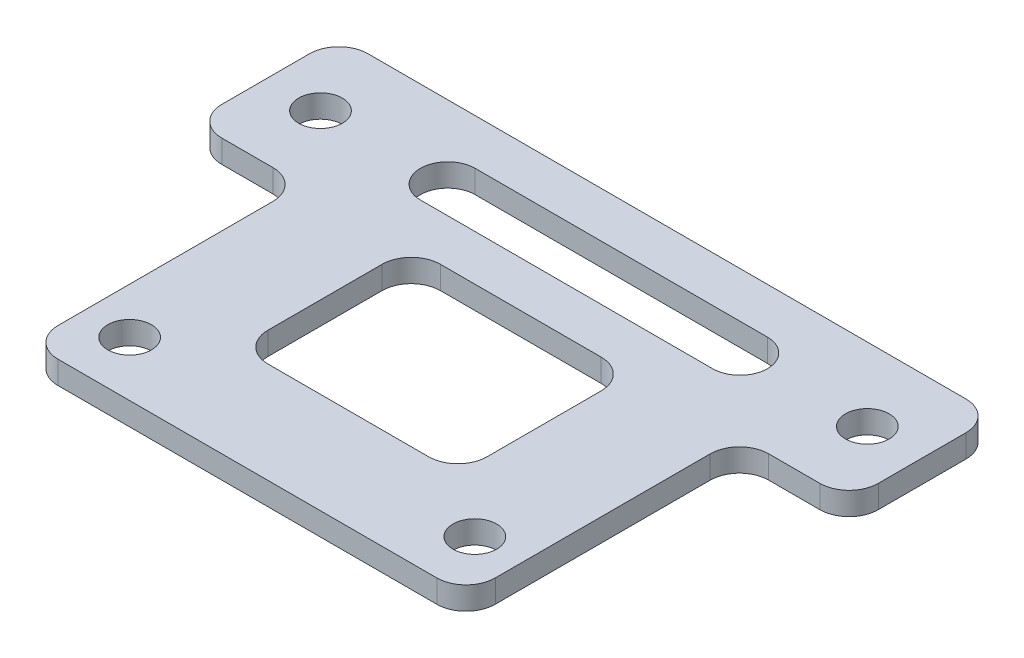
ISO-10303-21;
HEADER;
FILE_DESCRIPTION(('STEP AP214'),'2;1');
FILE_NAME('part.step','',(''),(''),'','','');
FILE_SCHEMA(('AUTOMOTIVE_DESIGN { 1 0 10303 214 1 1 1 1 }'));
ENDSEC;
DATA;
#1=APPLICATION_CONTEXT('core data for automotive mechanical design processes');
#2=APPLICATION_PROTOCOL_DEFINITION('international standard','automotive_design',2000,#1);
#3=PRODUCT_CONTEXT('',#1,'mechanical');
#4=PRODUCT('Part','Part','',(#3));
#5=PRODUCT_RELATED_PRODUCT_CATEGORY('part','',(#4));
#6=PRODUCT_DEFINITION_FORMATION('','',#4);
#7=PRODUCT_DEFINITION_CONTEXT('part definition',#1,'design');
#8=PRODUCT_DEFINITION('design','',#6,#7);
#9=PRODUCT_DEFINITION_SHAPE('','',#8);
#10=(LENGTH_UNIT() NAMED_UNIT(*) SI_UNIT(.MILLI.,.METRE.));
#11=(NAMED_UNIT(*) PLANE_ANGLE_UNIT() SI_UNIT($,.RADIAN.));
#12=(NAMED_UNIT(*) SI_UNIT($,.STERADIAN.) SOLID_ANGLE_UNIT());
#13=UNCERTAINTY_MEASURE_WITH_UNIT(LENGTH_MEASURE(1.E-05),#10,'distance_accuracy_value','');
#14=(GEOMETRIC_REPRESENTATION_CONTEXT(3) GLOBAL_UNCERTAINTY_ASSIGNED_CONTEXT((#13)) GLOBAL_UNIT_ASSIGNED_CONTEXT((#10,
#11,#12)) REPRESENTATION_CONTEXT('',''));
#15=CARTESIAN_POINT('',(0.,0.,0.));
#16=DIRECTION('',(0.,0.,1.));
#17=DIRECTION('',(1.,0.,0.));
#18=AXIS2_PLACEMENT_3D('',#15,#16,#17);
#19=CARTESIAN_POINT('',(0.,1.984375,0.));
#20=DIRECTION('',(0.,-1.,0.));
#21=DIRECTION('',(0.,0.,-1.));
#22=AXIS2_PLACEMENT_3D('',#19,#20,#21);
#23=PLANE('',#22);
#24=CARTESIAN_POINT('',(42.7625,1.984375,-30.1125));
#25=DIRECTION('',(0.,1.,0.));
#26=DIRECTION('',(0.,0.,1.));
#27=AXIS2_PLACEMENT_3D('',#24,#25,#26);
#28=CIRCLE('',#27,1.89865);
#29=CARTESIAN_POINT('',(42.7625,1.984375,-28.21385));
#30=VERTEX_POINT('',#29);
#31=EDGE_CURVE('E280',#30,#30,#28,.T.);
#32=ORIENTED_EDGE('',*,*,#31,.F.);
#33=EDGE_LOOP('',(#32));
#34=FACE_BOUND('',#33,.T.);
#35=CARTESIAN_POINT('',(-4.76250000000001,1.984375,-30.1125));
#36=DIRECTION('',(0.,1.,0.));
#37=DIRECTION('',(0.,0.,1.));
#38=AXIS2_PLACEMENT_3D('',#35,#36,#37);
#39=CIRCLE('',#38,1.89865);
#40=CARTESIAN_POINT('',(-4.76250000000001,1.984375,-28.21385));
#41=VERTEX_POINT('',#40);
#42=EDGE_CURVE('E288',#41,#41,#39,.T.);
#43=ORIENTED_EDGE('',*,*,#42,.F.);
#44=EDGE_LOOP('',(#43));
#45=FACE_BOUND('',#44,.T.);
#46=CARTESIAN_POINT('',(4.,1.984375,-4.7625));
#47=DIRECTION('',(0.,1.,0.));
#48=DIRECTION('',(0.,0.,1.));
#49=AXIS2_PLACEMENT_3D('',#46,#47,#48);
#50=CIRCLE('',#49,1.89865);
#51=CARTESIAN_POINT('',(4.,1.984375,-2.86385));
#52=VERTEX_POINT('',#51);
#53=EDGE_CURVE('E296',#52,#52,#50,.T.);
#54=ORIENTED_EDGE('',*,*,#53,.F.);
#55=EDGE_LOOP('',(#54));
#56=FACE_BOUND('',#55,.T.);
#57=CARTESIAN_POINT('',(34.,1.984375,-4.7625));
#58=DIRECTION('',(0.,1.,0.));
#59=DIRECTION('',(0.,0.,1.));
#60=AXIS2_PLACEMENT_3D('',#57,#58,#59);
#61=CIRCLE('',#60,1.89865);
#62=CARTESIAN_POINT('',(34.,1.984375,-2.86385));
#63=VERTEX_POINT('',#62);
#64=EDGE_CURVE('E304',#63,#63,#61,.T.);
#65=ORIENTED_EDGE('',*,*,#64,.F.);
#66=EDGE_LOOP('',(#65));
#67=FACE_BOUND('',#66,.T.);
#68=DIRECTION('',(0.,0.,-1.));
#69=VECTOR('',#68,1.);
#70=CARTESIAN_POINT('',(28.525,1.984375,-8.76250000000001));
#71=LINE('',#70,#69);
#72=CARTESIAN_POINT('',(28.525,1.984375,-11.3025));
#73=VERTEX_POINT('',#72);
#74=CARTESIAN_POINT('',(28.525,1.984375,-21.2225));
#75=VERTEX_POINT('',#74);
#76=EDGE_CURVE('E312',#73,#75,#71,.T.);
#77=ORIENTED_EDGE('',*,*,#76,.F.);
#78=CARTESIAN_POINT('',(25.985,1.984375,-11.3025));
#79=DIRECTION('',(0.,-1.,0.));
#80=DIRECTION('',(0.,0.,-1.));
#81=AXIS2_PLACEMENT_3D('',#78,#79,#80);
#82=CIRCLE('',#81,2.54);
#83=CARTESIAN_POINT('',(25.985,1.984375,-8.76250000000001));
#84=VERTEX_POINT('',#83);
#85=EDGE_CURVE('E549',#73,#84,#82,.T.);
#86=ORIENTED_EDGE('',*,*,#85,.T.);
#87=DIRECTION('',(1.,0.,0.));
#88=VECTOR('',#87,1.);
#89=CARTESIAN_POINT('',(9.475,1.984375,-8.76250000000001));
#90=LINE('',#89,#88);
#91=CARTESIAN_POINT('',(12.015,1.984375,-8.76250000000001));
#92=VERTEX_POINT('',#91);
#93=EDGE_CURVE('E325',#92,#84,#90,.T.);
#94=ORIENTED_EDGE('',*,*,#93,.F.);
#95=CARTESIAN_POINT('',(12.015,1.984375,-11.3025));
#96=DIRECTION('',(0.,-1.,0.));
#97=DIRECTION('',(0.,0.,-1.));
#98=AXIS2_PLACEMENT_3D('',#95,#96,#97);
#99=CIRCLE('',#98,2.54);
#100=CARTESIAN_POINT('',(9.475,1.984375,-11.3025));
#101=VERTEX_POINT('',#100);
#102=EDGE_CURVE('E537',#92,#101,#99,.T.);
#103=ORIENTED_EDGE('',*,*,#102,.T.);
#104=DIRECTION('',(0.,0.,1.));
#105=VECTOR('',#104,1.);
#106=CARTESIAN_POINT('',(9.47499999999999,1.984375,-23.7625));
#107=LINE('',#106,#105);
#108=CARTESIAN_POINT('',(9.475,1.984375,-21.2225));
#109=VERTEX_POINT('',#108);
#110=EDGE_CURVE('E321',#109,#101,#107,.T.);
#111=ORIENTED_EDGE('',*,*,#110,.F.);
#112=CARTESIAN_POINT('',(12.015,1.984375,-21.2225));
#113=DIRECTION('',(0.,-1.,0.));
#114=DIRECTION('',(0.,0.,-1.));
#115=AXIS2_PLACEMENT_3D('',#112,#113,#114);
#116=CIRCLE('',#115,2.54);
#117=CARTESIAN_POINT('',(12.015,1.984375,-23.7625));
#118=VERTEX_POINT('',#117);
#119=EDGE_CURVE('E543',#109,#118,#116,.T.);
#120=ORIENTED_EDGE('',*,*,#119,.T.);
#121=DIRECTION('',(-1.,0.,0.));
#122=VECTOR('',#121,1.);
#123=CARTESIAN_POINT('',(28.525,1.984375,-23.7625));
#124=LINE('',#123,#122);
#125=CARTESIAN_POINT('',(25.985,1.984375,-23.7625));
#126=VERTEX_POINT('',#125);
#127=EDGE_CURVE('E316',#126,#118,#124,.T.);
#128=ORIENTED_EDGE('',*,*,#127,.F.);
#129=CARTESIAN_POINT('',(25.985,1.984375,-21.2225));
#130=DIRECTION('',(0.,-1.,0.));
#131=DIRECTION('',(0.,0.,-1.));
#132=AXIS2_PLACEMENT_3D('',#129,#130,#131);
#133=CIRCLE('',#132,2.54);
#134=EDGE_CURVE('E11',#126,#75,#133,.T.);
#135=ORIENTED_EDGE('',*,*,#134,.T.);
#136=EDGE_LOOP('',(#77,#86,#94,#103,#111,#120,#128,#135));
#137=FACE_BOUND('',#136,.T.);
#138=DIRECTION('',(0.,0.,-1.));
#139=VECTOR('',#138,1.);
#140=CARTESIAN_POINT('',(47.525,1.984375,-23.7625));
#141=LINE('',#140,#139);
#142=CARTESIAN_POINT('',(47.525,1.984375,-26.3025));
#143=VERTEX_POINT('',#142);
#144=CARTESIAN_POINT('',(47.525,1.984375,-33.9225));
#145=VERTEX_POINT('',#144);
#146=EDGE_CURVE('E357',#143,#145,#141,.T.);
#147=ORIENTED_EDGE('',*,*,#146,.T.);
#148=CARTESIAN_POINT('',(44.985,1.984375,-33.9225));
#149=DIRECTION('',(0.,-1.,0.));
#150=DIRECTION('',(0.,0.,-1.));
#151=AXIS2_PLACEMENT_3D('',#148,#149,#150);
#152=CIRCLE('',#151,2.54);
#153=CARTESIAN_POINT('',(44.985,1.984375,-36.4625));
#154=VERTEX_POINT('',#153);
#155=EDGE_CURVE('E451',#145,#154,#152,.F.);
#156=ORIENTED_EDGE('',*,*,#155,.T.);
#157=DIRECTION('',(-1.,0.,0.));
#158=VECTOR('',#157,1.);
#159=CARTESIAN_POINT('',(47.525,1.984375,-36.4625));
#160=LINE('',#159,#158);
#161=CARTESIAN_POINT('',(-6.985,1.984375,-36.4625000000001));
#162=VERTEX_POINT('',#161);
#163=EDGE_CURVE('E361',#154,#162,#160,.T.);
#164=ORIENTED_EDGE('',*,*,#163,.T.);
#165=CARTESIAN_POINT('',(-6.985,1.984375,-33.9225));
#166=DIRECTION('',(0.,-1.,0.));
#167=DIRECTION('',(0.,0.,-1.));
#168=AXIS2_PLACEMENT_3D('',#165,#166,#167);
#169=CIRCLE('',#168,2.54);
#170=CARTESIAN_POINT('',(-9.52500000000001,1.984375,-33.9225));
#171=VERTEX_POINT('',#170);
#172=EDGE_CURVE('E445',#162,#171,#169,.F.);
#173=ORIENTED_EDGE('',*,*,#172,.T.);
#174=DIRECTION('',(0.,0.,1.));
#175=VECTOR('',#174,1.);
#176=CARTESIAN_POINT('',(-9.52500000000001,1.984375,-23.7625));
#177=LINE('',#176,#175);
#178=CARTESIAN_POINT('',(-9.52500000000001,1.984375,-26.3025));
#179=VERTEX_POINT('',#178);
#180=EDGE_CURVE('E365',#171,#179,#177,.T.);
#181=ORIENTED_EDGE('',*,*,#180,.T.);
#182=CARTESIAN_POINT('',(-6.985,1.984375,-26.3025));
#183=DIRECTION('',(0.,-1.,0.));
#184=DIRECTION('',(0.,0.,-1.));
#185=AXIS2_PLACEMENT_3D('',#182,#183,#184);
#186=CIRCLE('',#185,2.54);
#187=CARTESIAN_POINT('',(-6.985,1.984375,-23.7625));
#188=VERTEX_POINT('',#187);
#189=EDGE_CURVE('E442',#179,#188,#186,.F.);
#190=ORIENTED_EDGE('',*,*,#189,.T.);
#191=DIRECTION('',(1.,0.,0.));
#192=VECTOR('',#191,1.);
#193=CARTESIAN_POINT('',(0.,1.984375,-23.7625));
#194=LINE('',#193,#192);
#195=CARTESIAN_POINT('',(-2.54,1.984375,-23.7625));
#196=VERTEX_POINT('',#195);
#197=EDGE_CURVE('E369',#188,#196,#194,.T.);
#198=ORIENTED_EDGE('',*,*,#197,.T.);
#199=CARTESIAN_POINT('',(-2.54,1.984375,-21.2225));
#200=DIRECTION('',(0.,-1.,0.));
#201=DIRECTION('',(0.,0.,-1.));
#202=AXIS2_PLACEMENT_3D('',#199,#200,#201);
#203=CIRCLE('',#202,2.54);
#204=CARTESIAN_POINT('',(0.,1.984375,-21.2225));
#205=VERTEX_POINT('',#204);
#206=EDGE_CURVE('E62',#196,#205,#203,.T.);
#207=ORIENTED_EDGE('',*,*,#206,.T.);
#208=DIRECTION('',(0.,0.,1.));
#209=VECTOR('',#208,1.);
#210=CARTESIAN_POINT('',(0.,1.984375,0.));
#211=LINE('',#210,#209);
#212=CARTESIAN_POINT('',(0.,1.984375,-2.54));
#213=VERTEX_POINT('',#212);
#214=EDGE_CURVE('E372',#205,#213,#211,.T.);
#215=ORIENTED_EDGE('',*,*,#214,.T.);
#216=CARTESIAN_POINT('',(2.54,1.984375,-2.54));
#217=DIRECTION('',(0.,-1.,0.));
#218=DIRECTION('',(0.,0.,-1.));
#219=AXIS2_PLACEMENT_3D('',#216,#217,#218);
#220=CIRCLE('',#219,2.54);
#221=CARTESIAN_POINT('',(2.54000000000001,1.984375,0.));
#222=VERTEX_POINT('',#221);
#223=EDGE_CURVE('E439',#213,#222,#220,.F.);
#224=ORIENTED_EDGE('',*,*,#223,.T.);
#225=DIRECTION('',(1.,0.,0.));
#226=VECTOR('',#225,1.);
#227=CARTESIAN_POINT('',(27.0552310829366,1.984375,0.));
#228=LINE('',#227,#226);
#229=CARTESIAN_POINT('',(35.46,1.984375,0.));
#230=VERTEX_POINT('',#229);
#231=EDGE_CURVE('E344',#222,#230,#228,.T.);
#232=ORIENTED_EDGE('',*,*,#231,.T.);
#233=CARTESIAN_POINT('',(35.46,1.984375,-2.54));
#234=DIRECTION('',(0.,-1.,0.));
#235=DIRECTION('',(0.,0.,-1.));
#236=AXIS2_PLACEMENT_3D('',#233,#234,#235);
#237=CIRCLE('',#236,2.54);
#238=CARTESIAN_POINT('',(38.,1.984375,-2.54));
#239=VERTEX_POINT('',#238);
#240=EDGE_CURVE('E436',#230,#239,#237,.F.);
#241=ORIENTED_EDGE('',*,*,#240,.T.);
#242=DIRECTION('',(0.,0.,-1.));
#243=VECTOR('',#242,1.);
#244=CARTESIAN_POINT('',(38.,1.984375,-23.7625));
#245=LINE('',#244,#243);
#246=CARTESIAN_POINT('',(38.,1.984375,-21.2225));
#247=VERTEX_POINT('',#246);
#248=EDGE_CURVE('E348',#239,#247,#245,.T.);
#249=ORIENTED_EDGE('',*,*,#248,.T.);
#250=CARTESIAN_POINT('',(40.54,1.984375,-21.2225));
#251=DIRECTION('',(0.,-1.,0.));
#252=DIRECTION('',(0.,0.,-1.));
#253=AXIS2_PLACEMENT_3D('',#250,#251,#252);
#254=CIRCLE('',#253,2.54);
#255=CARTESIAN_POINT('',(40.54,1.984375,-23.7625));
#256=VERTEX_POINT('',#255);
#257=EDGE_CURVE('E526',#247,#256,#254,.T.);
#258=ORIENTED_EDGE('',*,*,#257,.T.);
#259=DIRECTION('',(1.,0.,0.));
#260=VECTOR('',#259,1.);
#261=CARTESIAN_POINT('',(38.,1.984375,-23.7625));
#262=LINE('',#261,#260);
#263=CARTESIAN_POINT('',(44.985,1.984375,-23.7625));
#264=VERTEX_POINT('',#263);
#265=EDGE_CURVE('E353',#256,#264,#262,.T.);
#266=ORIENTED_EDGE('',*,*,#265,.T.);
#267=CARTESIAN_POINT('',(44.985,1.984375,-26.3025));
#268=DIRECTION('',(0.,-1.,0.));
#269=DIRECTION('',(0.,0.,-1.));
#270=AXIS2_PLACEMENT_3D('',#267,#268,#269);
#271=CIRCLE('',#270,2.54);
#272=EDGE_CURVE('E448',#264,#143,#271,.F.);
#273=ORIENTED_EDGE('',*,*,#272,.T.);
#274=EDGE_LOOP('',(#147,#156,#164,#173,#181,#190,#198,#207,#215,#224,#232,#241,#249,#258,#266,#273));
#275=FACE_BOUND('',#274,.T.);
#276=CARTESIAN_POINT('',(6.3,1.984375,-30.1125));
#277=DIRECTION('',(0.,1.,0.));
#278=DIRECTION('',(0.,0.,1.));
#279=AXIS2_PLACEMENT_3D('',#276,#277,#278);
#280=CIRCLE('',#279,2.38125);
#281=CARTESIAN_POINT('',(6.29999999999999,1.984375,-32.49375));
#282=VERTEX_POINT('',#281);
#283=CARTESIAN_POINT('',(6.29999999999999,1.984375,-27.73125));
#284=VERTEX_POINT('',#283);
#285=EDGE_CURVE('E227',#282,#284,#280,.T.);
#286=ORIENTED_EDGE('',*,*,#285,.F.);
#287=DIRECTION('',(-1.,0.,0.));
#288=VECTOR('',#287,1.);
#289=CARTESIAN_POINT('',(6.29999999999999,1.984375,-32.49375));
#290=LINE('',#289,#288);
#291=CARTESIAN_POINT('',(31.7,1.984375,-32.49375));
#292=VERTEX_POINT('',#291);
#293=EDGE_CURVE('E256',#292,#282,#290,.T.);
#294=ORIENTED_EDGE('',*,*,#293,.F.);
#295=CARTESIAN_POINT('',(31.7,1.984375,-30.1125));
#296=DIRECTION('',(0.,1.,0.));
#297=DIRECTION('',(0.,0.,1.));
#298=AXIS2_PLACEMENT_3D('',#295,#296,#297);
#299=CIRCLE('',#298,2.38125);
#300=CARTESIAN_POINT('',(31.7,1.984375,-27.73125));
#301=VERTEX_POINT('',#300);
#302=EDGE_CURVE('E252',#301,#292,#299,.T.);
#303=ORIENTED_EDGE('',*,*,#302,.F.);
#304=DIRECTION('',(1.,0.,0.));
#305=VECTOR('',#304,1.);
#306=CARTESIAN_POINT('',(6.29999999999999,1.984375,-27.73125));
#307=LINE('',#306,#305);
#308=EDGE_CURVE('E238',#284,#301,#307,.T.);
#309=ORIENTED_EDGE('',*,*,#308,.F.);
#310=EDGE_LOOP('',(#286,#294,#303,#309));
#311=FACE_BOUND('',#310,.T.);
#312=ADVANCED_FACE('F39',(#34,#45,#56,#67,#137,#275,#311),#23,.F.);
#313=CARTESIAN_POINT('',(0.,0.,0.));
#314=DIRECTION('',(0.,-1.,0.));
#315=DIRECTION('',(0.,0.,-1.));
#316=AXIS2_PLACEMENT_3D('',#313,#314,#315);
#317=PLANE('',#316);
#318=CARTESIAN_POINT('',(-4.76250000000001,0.,-30.1125));
#319=DIRECTION('',(0.,1.,0.));
#320=DIRECTION('',(0.,0.,1.));
#321=AXIS2_PLACEMENT_3D('',#318,#319,#320);
#322=CIRCLE('',#321,1.89865);
#323=CARTESIAN_POINT('',(-4.76250000000001,0.,-28.21385));
#324=VERTEX_POINT('',#323);
#325=EDGE_CURVE('E284',#324,#324,#322,.T.);
#326=ORIENTED_EDGE('',*,*,#325,.T.);
#327=EDGE_LOOP('',(#326));
#328=FACE_BOUND('',#327,.T.);
#329=CARTESIAN_POINT('',(34.,0.,-4.7625));
#330=DIRECTION('',(0.,1.,0.));
#331=DIRECTION('',(0.,0.,1.));
#332=AXIS2_PLACEMENT_3D('',#329,#330,#331);
#333=CIRCLE('',#332,1.89865);
#334=CARTESIAN_POINT('',(34.,0.,-2.86385));
#335=VERTEX_POINT('',#334);
#336=EDGE_CURVE('E300',#335,#335,#333,.T.);
#337=ORIENTED_EDGE('',*,*,#336,.T.);
#338=EDGE_LOOP('',(#337));
#339=FACE_BOUND('',#338,.T.);
#340=DIRECTION('',(-1.,0.,0.));
#341=VECTOR('',#340,1.);
#342=CARTESIAN_POINT('',(-9.52500000000001,0.,-36.4625));
#343=LINE('',#342,#341);
#344=CARTESIAN_POINT('',(44.985,0.,-36.4625));
#345=VERTEX_POINT('',#344);
#346=CARTESIAN_POINT('',(-6.985,0.,-36.4625));
#347=VERTEX_POINT('',#346);
#348=EDGE_CURVE('E391',#345,#347,#343,.T.);
#349=ORIENTED_EDGE('',*,*,#348,.F.);
#350=CARTESIAN_POINT('',(44.985,0.,-33.9225));
#351=DIRECTION('',(0.,-1.,0.));
#352=DIRECTION('',(0.,0.,-1.));
#353=AXIS2_PLACEMENT_3D('',#350,#351,#352);
#354=CIRCLE('',#353,2.54);
#355=CARTESIAN_POINT('',(47.525,0.,-33.9225));
#356=VERTEX_POINT('',#355);
#357=EDGE_CURVE('E426',#345,#356,#354,.T.);
#358=ORIENTED_EDGE('',*,*,#357,.T.);
#359=DIRECTION('',(0.,0.,-1.));
#360=VECTOR('',#359,1.);
#361=CARTESIAN_POINT('',(47.525,0.,-23.7625));
#362=LINE('',#361,#360);
#363=CARTESIAN_POINT('',(47.525,0.,-26.3025));
#364=VERTEX_POINT('',#363);
#365=EDGE_CURVE('E387',#364,#356,#362,.T.);
#366=ORIENTED_EDGE('',*,*,#365,.F.);
#367=CARTESIAN_POINT('',(44.985,0.,-26.3025));
#368=DIRECTION('',(0.,-1.,0.));
#369=DIRECTION('',(0.,0.,-1.));
#370=AXIS2_PLACEMENT_3D('',#367,#368,#369);
#371=CIRCLE('',#370,2.54);
#372=CARTESIAN_POINT('',(44.985,0.,-23.7625));
#373=VERTEX_POINT('',#372);
#374=EDGE_CURVE('E423',#364,#373,#371,.T.);
#375=ORIENTED_EDGE('',*,*,#374,.T.);
#376=DIRECTION('',(1.,0.,0.));
#377=VECTOR('',#376,1.);
#378=CARTESIAN_POINT('',(38.,0.,-23.7625));
#379=LINE('',#378,#377);
#380=CARTESIAN_POINT('',(40.54,0.,-23.7625));
#381=VERTEX_POINT('',#380);
#382=EDGE_CURVE('E383',#381,#373,#379,.T.);
#383=ORIENTED_EDGE('',*,*,#382,.F.);
#384=CARTESIAN_POINT('',(40.54,0.,-21.2225));
#385=DIRECTION('',(0.,-1.,0.));
#386=DIRECTION('',(0.,0.,-1.));
#387=AXIS2_PLACEMENT_3D('',#384,#385,#386);
#388=CIRCLE('',#387,2.54);
#389=CARTESIAN_POINT('',(38.,0.,-21.2225));
#390=VERTEX_POINT('',#389);
#391=EDGE_CURVE('E523',#381,#390,#388,.F.);
#392=ORIENTED_EDGE('',*,*,#391,.T.);
#393=DIRECTION('',(0.,0.,-1.));
#394=VECTOR('',#393,1.);
#395=CARTESIAN_POINT('',(38.,0.,-23.7625));
#396=LINE('',#395,#394);
#397=CARTESIAN_POINT('',(38.,0.,-2.54));
#398=VERTEX_POINT('',#397);
#399=EDGE_CURVE('E379',#398,#390,#396,.T.);
#400=ORIENTED_EDGE('',*,*,#399,.F.);
#401=CARTESIAN_POINT('',(35.46,0.,-2.54));
#402=DIRECTION('',(0.,-1.,0.));
#403=DIRECTION('',(0.,0.,-1.));
#404=AXIS2_PLACEMENT_3D('',#401,#402,#403);
#405=CIRCLE('',#404,2.54);
#406=CARTESIAN_POINT('',(35.46,0.,0.));
#407=VERTEX_POINT('',#406);
#408=EDGE_CURVE('E411',#398,#407,#405,.T.);
#409=ORIENTED_EDGE('',*,*,#408,.T.);
#410=DIRECTION('',(1.,0.,0.));
#411=VECTOR('',#410,1.);
#412=CARTESIAN_POINT('',(38.,0.,0.));
#413=LINE('',#412,#411);
#414=CARTESIAN_POINT('',(2.54,0.,0.));
#415=VERTEX_POINT('',#414);
#416=EDGE_CURVE('E329',#415,#407,#413,.T.);
#417=ORIENTED_EDGE('',*,*,#416,.F.);
#418=CARTESIAN_POINT('',(2.54,0.,-2.54));
#419=DIRECTION('',(0.,-1.,0.));
#420=DIRECTION('',(0.,0.,-1.));
#421=AXIS2_PLACEMENT_3D('',#418,#419,#420);
#422=CIRCLE('',#421,2.54);
#423=CARTESIAN_POINT('',(0.,0.,-2.54));
#424=VERTEX_POINT('',#423);
#425=EDGE_CURVE('E414',#415,#424,#422,.T.);
#426=ORIENTED_EDGE('',*,*,#425,.T.);
#427=DIRECTION('',(0.,0.,1.));
#428=VECTOR('',#427,1.);
#429=CARTESIAN_POINT('',(0.,0.,0.));
#430=LINE('',#429,#428);
#431=CARTESIAN_POINT('',(0.,0.,-21.2225));
#432=VERTEX_POINT('',#431);
#433=EDGE_CURVE('E349',#432,#424,#430,.T.);
#434=ORIENTED_EDGE('',*,*,#433,.F.);
#435=CARTESIAN_POINT('',(-2.54,0.,-21.2225));
#436=DIRECTION('',(0.,-1.,0.));
#437=DIRECTION('',(0.,0.,-1.));
#438=AXIS2_PLACEMENT_3D('',#435,#436,#437);
#439=CIRCLE('',#438,2.54);
#440=CARTESIAN_POINT('',(-2.54,0.,-23.7625));
#441=VERTEX_POINT('',#440);
#442=EDGE_CURVE('E529',#432,#441,#439,.F.);
#443=ORIENTED_EDGE('',*,*,#442,.T.);
#444=DIRECTION('',(1.,0.,0.));
#445=VECTOR('',#444,1.);
#446=CARTESIAN_POINT('',(0.,0.,-23.7625));
#447=LINE('',#446,#445);
#448=CARTESIAN_POINT('',(-6.985,0.,-23.7625));
#449=VERTEX_POINT('',#448);
#450=EDGE_CURVE('E399',#449,#441,#447,.T.);
#451=ORIENTED_EDGE('',*,*,#450,.F.);
#452=CARTESIAN_POINT('',(-6.985,0.,-26.3025));
#453=DIRECTION('',(0.,-1.,0.));
#454=DIRECTION('',(0.,0.,-1.));
#455=AXIS2_PLACEMENT_3D('',#452,#453,#454);
#456=CIRCLE('',#455,2.54);
#457=CARTESIAN_POINT('',(-9.52500000000001,0.,-26.3025));
#458=VERTEX_POINT('',#457);
#459=EDGE_CURVE('E417',#449,#458,#456,.T.);
#460=ORIENTED_EDGE('',*,*,#459,.T.);
#461=DIRECTION('',(0.,0.,1.));
#462=VECTOR('',#461,1.);
#463=CARTESIAN_POINT('',(-9.52500000000001,0.,-23.7625));
#464=LINE('',#463,#462);
#465=CARTESIAN_POINT('',(-9.52500000000001,0.,-33.9225));
#466=VERTEX_POINT('',#465);
#467=EDGE_CURVE('E395',#466,#458,#464,.T.);
#468=ORIENTED_EDGE('',*,*,#467,.F.);
#469=CARTESIAN_POINT('',(-6.985,0.,-33.9225));
#470=DIRECTION('',(0.,-1.,0.));
#471=DIRECTION('',(0.,0.,-1.));
#472=AXIS2_PLACEMENT_3D('',#469,#470,#471);
#473=CIRCLE('',#472,2.54);
#474=EDGE_CURVE('E420',#466,#347,#473,.T.);
#475=ORIENTED_EDGE('',*,*,#474,.T.);
#476=EDGE_LOOP('',(#349,#358,#366,#375,#383,#392,#400,#409,#417,#426,#434,#443,#451,#460,#468,#475));
#477=FACE_BOUND('',#476,.T.);
#478=DIRECTION('',(0.,0.,1.));
#479=VECTOR('',#478,1.);
#480=CARTESIAN_POINT('',(9.47499999999999,0.,-23.7625));
#481=LINE('',#480,#479);
#482=CARTESIAN_POINT('',(9.475,0.,-21.2225));
#483=VERTEX_POINT('',#482);
#484=CARTESIAN_POINT('',(9.475,0.,-11.3025));
#485=VERTEX_POINT('',#484);
#486=EDGE_CURVE('E337',#483,#485,#481,.T.);
#487=ORIENTED_EDGE('',*,*,#486,.T.);
#488=CARTESIAN_POINT('',(12.015,0.,-11.3025));
#489=DIRECTION('',(0.,-1.,0.));
#490=DIRECTION('',(0.,0.,-1.));
#491=AXIS2_PLACEMENT_3D('',#488,#489,#490);
#492=CIRCLE('',#491,2.54);
#493=CARTESIAN_POINT('',(12.015,0.,-8.76250000000001));
#494=VERTEX_POINT('',#493);
#495=EDGE_CURVE('E534',#485,#494,#492,.F.);
#496=ORIENTED_EDGE('',*,*,#495,.T.);
#497=DIRECTION('',(1.,0.,0.));
#498=VECTOR('',#497,1.);
#499=CARTESIAN_POINT('',(9.475,0.,-8.76250000000001));
#500=LINE('',#499,#498);
#501=CARTESIAN_POINT('',(25.985,0.,-8.76250000000001));
#502=VERTEX_POINT('',#501);
#503=EDGE_CURVE('E317',#494,#502,#500,.T.);
#504=ORIENTED_EDGE('',*,*,#503,.T.);
#505=CARTESIAN_POINT('',(25.985,0.,-11.3025));
#506=DIRECTION('',(0.,-1.,0.));
#507=DIRECTION('',(0.,0.,-1.));
#508=AXIS2_PLACEMENT_3D('',#505,#506,#507);
#509=CIRCLE('',#508,2.54);
#510=CARTESIAN_POINT('',(28.525,0.,-11.3025));
#511=VERTEX_POINT('',#510);
#512=EDGE_CURVE('E546',#502,#511,#509,.F.);
#513=ORIENTED_EDGE('',*,*,#512,.T.);
#514=DIRECTION('',(0.,0.,-1.));
#515=VECTOR('',#514,1.);
#516=CARTESIAN_POINT('',(28.525,0.,-8.76250000000001));
#517=LINE('',#516,#515);
#518=CARTESIAN_POINT('',(28.525,0.,-21.2225));
#519=VERTEX_POINT('',#518);
#520=EDGE_CURVE('E308',#511,#519,#517,.T.);
#521=ORIENTED_EDGE('',*,*,#520,.T.);
#522=CARTESIAN_POINT('',(25.985,0.,-21.2225));
#523=DIRECTION('',(0.,-1.,0.));
#524=DIRECTION('',(0.,0.,-1.));
#525=AXIS2_PLACEMENT_3D('',#522,#523,#524);
#526=CIRCLE('',#525,2.54);
#527=CARTESIAN_POINT('',(25.985,0.,-23.7625));
#528=VERTEX_POINT('',#527);
#529=EDGE_CURVE('E48',#519,#528,#526,.F.);
#530=ORIENTED_EDGE('',*,*,#529,.T.);
#531=DIRECTION('',(-1.,0.,0.));
#532=VECTOR('',#531,1.);
#533=CARTESIAN_POINT('',(28.525,0.,-23.7625));
#534=LINE('',#533,#532);
#535=CARTESIAN_POINT('',(12.015,0.,-23.7625));
#536=VERTEX_POINT('',#535);
#537=EDGE_CURVE('E333',#528,#536,#534,.T.);
#538=ORIENTED_EDGE('',*,*,#537,.T.);
#539=CARTESIAN_POINT('',(12.015,0.,-21.2225));
#540=DIRECTION('',(0.,-1.,0.));
#541=DIRECTION('',(0.,0.,-1.));
#542=AXIS2_PLACEMENT_3D('',#539,#540,#541);
#543=CIRCLE('',#542,2.54);
#544=EDGE_CURVE('E540',#536,#483,#543,.F.);
#545=ORIENTED_EDGE('',*,*,#544,.T.);
#546=EDGE_LOOP('',(#487,#496,#504,#513,#521,#530,#538,#545));
#547=FACE_BOUND('',#546,.T.);
#548=CARTESIAN_POINT('',(4.,0.,-4.7625));
#549=DIRECTION('',(0.,1.,0.));
#550=DIRECTION('',(0.,0.,1.));
#551=AXIS2_PLACEMENT_3D('',#548,#549,#550);
#552=CIRCLE('',#551,1.89865);
#553=CARTESIAN_POINT('',(4.,0.,-2.86385));
#554=VERTEX_POINT('',#553);
#555=EDGE_CURVE('E292',#554,#554,#552,.T.);
#556=ORIENTED_EDGE('',*,*,#555,.T.);
#557=EDGE_LOOP('',(#556));
#558=FACE_BOUND('',#557,.T.);
#559=CARTESIAN_POINT('',(42.7625,0.,-30.1125));
#560=DIRECTION('',(0.,1.,0.));
#561=DIRECTION('',(0.,0.,1.));
#562=AXIS2_PLACEMENT_3D('',#559,#560,#561);
#563=CIRCLE('',#562,1.89865);
#564=CARTESIAN_POINT('',(42.7625,0.,-28.21385));
#565=VERTEX_POINT('',#564);
#566=EDGE_CURVE('E247',#565,#565,#563,.T.);
#567=ORIENTED_EDGE('',*,*,#566,.T.);
#568=EDGE_LOOP('',(#567));
#569=FACE_BOUND('',#568,.T.);
#570=DIRECTION('',(-1.,0.,0.));
#571=VECTOR('',#570,1.);
#572=CARTESIAN_POINT('',(6.29999999999999,0.,-32.49375));
#573=LINE('',#572,#571);
#574=CARTESIAN_POINT('',(31.7,0.,-32.49375));
#575=VERTEX_POINT('',#574);
#576=CARTESIAN_POINT('',(6.29999999999999,0.,-32.49375));
#577=VERTEX_POINT('',#576);
#578=EDGE_CURVE('E239',#575,#577,#573,.T.);
#579=ORIENTED_EDGE('',*,*,#578,.T.);
#580=CARTESIAN_POINT('',(6.3,0.,-30.1125));
#581=DIRECTION('',(0.,1.,0.));
#582=DIRECTION('',(0.,0.,1.));
#583=AXIS2_PLACEMENT_3D('',#580,#581,#582);
#584=CIRCLE('',#583,2.38125);
#585=CARTESIAN_POINT('',(6.29999999999999,0.,-27.73125));
#586=VERTEX_POINT('',#585);
#587=EDGE_CURVE('E261',#577,#586,#584,.T.);
#588=ORIENTED_EDGE('',*,*,#587,.T.);
#589=DIRECTION('',(1.,0.,0.));
#590=VECTOR('',#589,1.);
#591=CARTESIAN_POINT('',(6.29999999999999,0.,-27.73125));
#592=LINE('',#591,#590);
#593=CARTESIAN_POINT('',(31.7,0.,-27.73125));
#594=VERTEX_POINT('',#593);
#595=EDGE_CURVE('E245',#586,#594,#592,.T.);
#596=ORIENTED_EDGE('',*,*,#595,.T.);
#597=CARTESIAN_POINT('',(31.7,0.,-30.1125));
#598=DIRECTION('',(0.,1.,0.));
#599=DIRECTION('',(0.,0.,1.));
#600=AXIS2_PLACEMENT_3D('',#597,#598,#599);
#601=CIRCLE('',#600,2.38125);
#602=EDGE_CURVE('E266',#594,#575,#601,.T.);
#603=ORIENTED_EDGE('',*,*,#602,.T.);
#604=EDGE_LOOP('',(#579,#588,#596,#603));
#605=FACE_BOUND('',#604,.T.);
#606=ADVANCED_FACE('F554',(#328,#339,#477,#547,#558,#569,#605),#317,.T.);
#607=CARTESIAN_POINT('',(38.,1.984375,0.));
#608=DIRECTION('',(0.,0.,-1.));
#609=DIRECTION('',(-1.,0.,0.));
#610=AXIS2_PLACEMENT_3D('',#607,#608,#609);
#611=PLANE('',#610);
#612=ORIENTED_EDGE('',*,*,#231,.F.);
#613=DIRECTION('',(0.,-1.,0.));
#614=VECTOR('',#613,1.);
#615=CARTESIAN_POINT('',(2.54,1.984375,0.));
#616=LINE('',#615,#614);
#617=EDGE_CURVE('E519',#222,#415,#616,.T.);
#618=ORIENTED_EDGE('',*,*,#617,.T.);
#619=ORIENTED_EDGE('',*,*,#416,.T.);
#620=DIRECTION('',(0.,-1.,0.));
#621=VECTOR('',#620,1.);
#622=CARTESIAN_POINT('',(35.46,1.984375,0.));
#623=LINE('',#622,#621);
#624=EDGE_CURVE('E516',#407,#230,#623,.F.);
#625=ORIENTED_EDGE('',*,*,#624,.T.);
#626=EDGE_LOOP('',(#612,#618,#619,#625));
#627=FACE_BOUND('',#626,.T.);
#628=ADVANCED_FACE('F607',(#627),#611,.F.);
#629=CARTESIAN_POINT('',(38.,1.984375,-23.7625));
#630=DIRECTION('',(-1.,0.,0.));
#631=DIRECTION('',(0.,0.,1.));
#632=AXIS2_PLACEMENT_3D('',#629,#630,#631);
#633=PLANE('',#632);
#634=ORIENTED_EDGE('',*,*,#399,.T.);
#635=DIRECTION('',(0.,-1.,0.));
#636=VECTOR('',#635,1.);
#637=CARTESIAN_POINT('',(38.,1.984375,-21.2225));
#638=LINE('',#637,#636);
#639=EDGE_CURVE('E465',#390,#247,#638,.F.);
#640=ORIENTED_EDGE('',*,*,#639,.T.);
#641=ORIENTED_EDGE('',*,*,#248,.F.);
#642=DIRECTION('',(0.,-1.,0.));
#643=VECTOR('',#642,1.);
#644=CARTESIAN_POINT('',(38.,1.984375,-2.54));
#645=LINE('',#644,#643);
#646=EDGE_CURVE('E461',#239,#398,#645,.T.);
#647=ORIENTED_EDGE('',*,*,#646,.T.);
#648=EDGE_LOOP('',(#634,#640,#641,#647));
#649=FACE_BOUND('',#648,.T.);
#650=ADVANCED_FACE('F637',(#649),#633,.F.);
#651=CARTESIAN_POINT('',(38.,1.984375,-23.7625));
#652=DIRECTION('',(0.,0.,-1.));
#653=DIRECTION('',(-1.,0.,0.));
#654=AXIS2_PLACEMENT_3D('',#651,#652,#653);
#655=PLANE('',#654);
#656=ORIENTED_EDGE('',*,*,#382,.T.);
#657=DIRECTION('',(0.,-1.,0.));
#658=VECTOR('',#657,1.);
#659=CARTESIAN_POINT('',(44.985,1.984375,-23.7625));
#660=LINE('',#659,#658);
#661=EDGE_CURVE('E458',#373,#264,#660,.F.);
#662=ORIENTED_EDGE('',*,*,#661,.T.);
#663=ORIENTED_EDGE('',*,*,#265,.F.);
#664=DIRECTION('',(0.,-1.,0.));
#665=VECTOR('',#664,1.);
#666=CARTESIAN_POINT('',(40.54,0.,-23.7625));
#667=LINE('',#666,#665);
#668=EDGE_CURVE('E454',#256,#381,#667,.T.);
#669=ORIENTED_EDGE('',*,*,#668,.T.);
#670=EDGE_LOOP('',(#656,#662,#663,#669));
#671=FACE_BOUND('',#670,.T.);
#672=ADVANCED_FACE('F633',(#671),#655,.F.);
#673=CARTESIAN_POINT('',(47.525,1.984375,-23.7625));
#674=DIRECTION('',(-1.,0.,0.));
#675=DIRECTION('',(0.,0.,1.));
#676=AXIS2_PLACEMENT_3D('',#673,#674,#675);
#677=PLANE('',#676);
#678=ORIENTED_EDGE('',*,*,#365,.T.);
#679=DIRECTION('',(0.,-1.,0.));
#680=VECTOR('',#679,1.);
#681=CARTESIAN_POINT('',(47.525,1.984375,-33.9225));
#682=LINE('',#681,#680);
#683=EDGE_CURVE('E433',#356,#145,#682,.F.);
#684=ORIENTED_EDGE('',*,*,#683,.T.);
#685=ORIENTED_EDGE('',*,*,#146,.F.);
#686=DIRECTION('',(0.,-1.,0.));
#687=VECTOR('',#686,1.);
#688=CARTESIAN_POINT('',(47.525,1.984375,-26.3025));
#689=LINE('',#688,#687);
#690=EDGE_CURVE('E429',#143,#364,#689,.T.);
#691=ORIENTED_EDGE('',*,*,#690,.T.);
#692=EDGE_LOOP('',(#678,#684,#685,#691));
#693=FACE_BOUND('',#692,.T.);
#694=ADVANCED_FACE('F629',(#693),#677,.F.);
#695=CARTESIAN_POINT('',(-9.52500000000001,1.984375,-36.4625));
#696=DIRECTION('',(0.,0.,1.));
#697=DIRECTION('',(1.,0.,0.));
#698=AXIS2_PLACEMENT_3D('',#695,#696,#697);
#699=PLANE('',#698);
#700=ORIENTED_EDGE('',*,*,#163,.F.);
#701=DIRECTION('',(0.,-1.,0.));
#702=VECTOR('',#701,1.);
#703=CARTESIAN_POINT('',(44.985,1.984375,-36.4625));
#704=LINE('',#703,#702);
#705=EDGE_CURVE('E407',#154,#345,#704,.T.);
#706=ORIENTED_EDGE('',*,*,#705,.T.);
#707=ORIENTED_EDGE('',*,*,#348,.T.);
#708=DIRECTION('',(0.,-1.,0.));
#709=VECTOR('',#708,1.);
#710=CARTESIAN_POINT('',(-6.985,1.984375,-36.4625));
#711=LINE('',#710,#709);
#712=EDGE_CURVE('E375',#347,#162,#711,.F.);
#713=ORIENTED_EDGE('',*,*,#712,.T.);
#714=EDGE_LOOP('',(#700,#706,#707,#713));
#715=FACE_BOUND('',#714,.T.);
#716=ADVANCED_FACE('F625',(#715),#699,.F.);
#717=CARTESIAN_POINT('',(-9.52500000000001,1.984375,-23.7625));
#718=DIRECTION('',(1.,0.,0.));
#719=DIRECTION('',(0.,0.,-1.));
#720=AXIS2_PLACEMENT_3D('',#717,#718,#719);
#721=PLANE('',#720);
#722=ORIENTED_EDGE('',*,*,#180,.F.);
#723=DIRECTION('',(0.,-1.,0.));
#724=VECTOR('',#723,1.);
#725=CARTESIAN_POINT('',(-9.52500000000001,1.984375,-33.9225));
#726=LINE('',#725,#724);
#727=EDGE_CURVE('E471',#171,#466,#726,.T.);
#728=ORIENTED_EDGE('',*,*,#727,.T.);
#729=ORIENTED_EDGE('',*,*,#467,.T.);
#730=DIRECTION('',(0.,-1.,0.));
#731=VECTOR('',#730,1.);
#732=CARTESIAN_POINT('',(-9.52500000000001,1.984375,-26.3025));
#733=LINE('',#732,#731);
#734=EDGE_CURVE('E468',#458,#179,#733,.F.);
#735=ORIENTED_EDGE('',*,*,#734,.T.);
#736=EDGE_LOOP('',(#722,#728,#729,#735));
#737=FACE_BOUND('',#736,.T.);
#738=ADVANCED_FACE('F621',(#737),#721,.F.);
#739=CARTESIAN_POINT('',(0.,1.984375,-23.7625));
#740=DIRECTION('',(0.,0.,-1.));
#741=DIRECTION('',(-1.,0.,0.));
#742=AXIS2_PLACEMENT_3D('',#739,#740,#741);
#743=PLANE('',#742);
#744=ORIENTED_EDGE('',*,*,#197,.F.);
#745=DIRECTION('',(0.,-1.,0.));
#746=VECTOR('',#745,1.);
#747=CARTESIAN_POINT('',(-6.98500000000001,1.984375,-23.7625));
#748=LINE('',#747,#746);
#749=EDGE_CURVE('E478',#188,#449,#748,.T.);
#750=ORIENTED_EDGE('',*,*,#749,.T.);
#751=ORIENTED_EDGE('',*,*,#450,.T.);
#752=DIRECTION('',(0.,-1.,0.));
#753=VECTOR('',#752,1.);
#754=CARTESIAN_POINT('',(-2.54,1.984375,-23.7625));
#755=LINE('',#754,#753);
#756=EDGE_CURVE('E475',#441,#196,#755,.F.);
#757=ORIENTED_EDGE('',*,*,#756,.T.);
#758=EDGE_LOOP('',(#744,#750,#751,#757));
#759=FACE_BOUND('',#758,.T.);
#760=ADVANCED_FACE('F618',(#759),#743,.F.);
#761=CARTESIAN_POINT('',(0.,1.984375,0.));
#762=DIRECTION('',(1.,0.,0.));
#763=DIRECTION('',(0.,0.,-1.));
#764=AXIS2_PLACEMENT_3D('',#761,#762,#763);
#765=PLANE('',#764);
#766=ORIENTED_EDGE('',*,*,#214,.F.);
#767=DIRECTION('',(0.,-1.,0.));
#768=VECTOR('',#767,1.);
#769=CARTESIAN_POINT('',(0.,0.,-21.2225));
#770=LINE('',#769,#768);
#771=EDGE_CURVE('E484',#205,#432,#770,.T.);
#772=ORIENTED_EDGE('',*,*,#771,.T.);
#773=ORIENTED_EDGE('',*,*,#433,.T.);
#774=DIRECTION('',(0.,-1.,0.));
#775=VECTOR('',#774,1.);
#776=CARTESIAN_POINT('',(0.,1.984375,-2.54));
#777=LINE('',#776,#775);
#778=EDGE_CURVE('E55',#424,#213,#777,.F.);
#779=ORIENTED_EDGE('',*,*,#778,.T.);
#780=EDGE_LOOP('',(#766,#772,#773,#779));
#781=FACE_BOUND('',#780,.T.);
#782=ADVANCED_FACE('F615',(#781),#765,.F.);
#783=CARTESIAN_POINT('',(28.525,1.984375,-8.76250000000001));
#784=DIRECTION('',(-1.,0.,0.));
#785=DIRECTION('',(0.,0.,1.));
#786=AXIS2_PLACEMENT_3D('',#783,#784,#785);
#787=PLANE('',#786);
#788=ORIENTED_EDGE('',*,*,#520,.F.);
#789=DIRECTION('',(0.,-1.,0.));
#790=VECTOR('',#789,1.);
#791=CARTESIAN_POINT('',(28.525,1.984375,-11.3025));
#792=LINE('',#791,#790);
#793=EDGE_CURVE('E513',#511,#73,#792,.F.);
#794=ORIENTED_EDGE('',*,*,#793,.T.);
#795=ORIENTED_EDGE('',*,*,#76,.T.);
#796=DIRECTION('',(0.,-1.,0.));
#797=VECTOR('',#796,1.);
#798=CARTESIAN_POINT('',(28.525,0.,-21.2225));
#799=LINE('',#798,#797);
#800=EDGE_CURVE('E509',#75,#519,#799,.T.);
#801=ORIENTED_EDGE('',*,*,#800,.T.);
#802=EDGE_LOOP('',(#788,#794,#795,#801));
#803=FACE_BOUND('',#802,.T.);
#804=ADVANCED_FACE('F570',(#803),#787,.T.);
#805=CARTESIAN_POINT('',(28.525,1.984375,-23.7625));
#806=DIRECTION('',(0.,0.,1.));
#807=DIRECTION('',(1.,0.,0.));
#808=AXIS2_PLACEMENT_3D('',#805,#806,#807);
#809=PLANE('',#808);
#810=ORIENTED_EDGE('',*,*,#127,.T.);
#811=DIRECTION('',(0.,-1.,0.));
#812=VECTOR('',#811,1.);
#813=CARTESIAN_POINT('',(12.015,0.,-23.7625));
#814=LINE('',#813,#812);
#815=EDGE_CURVE('E505',#118,#536,#814,.T.);
#816=ORIENTED_EDGE('',*,*,#815,.T.);
#817=ORIENTED_EDGE('',*,*,#537,.F.);
#818=DIRECTION('',(0.,-1.,0.));
#819=VECTOR('',#818,1.);
#820=CARTESIAN_POINT('',(25.985,1.984375,-23.7625));
#821=LINE('',#820,#819);
#822=EDGE_CURVE('E502',#528,#126,#821,.F.);
#823=ORIENTED_EDGE('',*,*,#822,.T.);
#824=EDGE_LOOP('',(#810,#816,#817,#823));
#825=FACE_BOUND('',#824,.T.);
#826=ADVANCED_FACE('F561',(#825),#809,.T.);
#827=CARTESIAN_POINT('',(9.47499999999999,1.984375,-23.7625));
#828=DIRECTION('',(1.,0.,0.));
#829=DIRECTION('',(0.,0.,-1.));
#830=AXIS2_PLACEMENT_3D('',#827,#828,#829);
#831=PLANE('',#830);
#832=ORIENTED_EDGE('',*,*,#110,.T.);
#833=DIRECTION('',(0.,-1.,0.));
#834=VECTOR('',#833,1.);
#835=CARTESIAN_POINT('',(9.475,0.,-11.3025));
#836=LINE('',#835,#834);
#837=EDGE_CURVE('E491',#101,#485,#836,.T.);
#838=ORIENTED_EDGE('',*,*,#837,.T.);
#839=ORIENTED_EDGE('',*,*,#486,.F.);
#840=DIRECTION('',(0.,-1.,0.));
#841=VECTOR('',#840,1.);
#842=CARTESIAN_POINT('',(9.475,1.984375,-21.2225));
#843=LINE('',#842,#841);
#844=EDGE_CURVE('E488',#483,#109,#843,.F.);
#845=ORIENTED_EDGE('',*,*,#844,.T.);
#846=EDGE_LOOP('',(#832,#838,#839,#845));
#847=FACE_BOUND('',#846,.T.);
#848=ADVANCED_FACE('F587',(#847),#831,.T.);
#849=CARTESIAN_POINT('',(9.475,1.984375,-8.76250000000001));
#850=DIRECTION('',(0.,0.,-1.));
#851=DIRECTION('',(-1.,0.,0.));
#852=AXIS2_PLACEMENT_3D('',#849,#850,#851);
#853=PLANE('',#852);
#854=ORIENTED_EDGE('',*,*,#503,.F.);
#855=DIRECTION('',(0.,-1.,0.));
#856=VECTOR('',#855,1.);
#857=CARTESIAN_POINT('',(12.015,1.984375,-8.76250000000001));
#858=LINE('',#857,#856);
#859=EDGE_CURVE('E499',#494,#92,#858,.F.);
#860=ORIENTED_EDGE('',*,*,#859,.T.);
#861=ORIENTED_EDGE('',*,*,#93,.T.);
#862=DIRECTION('',(0.,-1.,0.));
#863=VECTOR('',#862,1.);
#864=CARTESIAN_POINT('',(25.985,0.,-8.76250000000001));
#865=LINE('',#864,#863);
#866=EDGE_CURVE('E495',#84,#502,#865,.T.);
#867=ORIENTED_EDGE('',*,*,#866,.T.);
#868=EDGE_LOOP('',(#854,#860,#861,#867));
#869=FACE_BOUND('',#868,.T.);
#870=ADVANCED_FACE('F579',(#869),#853,.T.);
#871=CARTESIAN_POINT('',(34.,1.984375,-4.7625));
#872=DIRECTION('',(0.,-1.,0.));
#873=DIRECTION('',(0.,0.,-1.));
#874=AXIS2_PLACEMENT_3D('',#871,#872,#873);
#875=CYLINDRICAL_SURFACE('',#874,1.89865);
#876=ORIENTED_EDGE('',*,*,#64,.T.);
#877=EDGE_LOOP('',(#876));
#878=FACE_BOUND('',#877,.T.);
#879=ORIENTED_EDGE('',*,*,#336,.F.);
#880=EDGE_LOOP('',(#879));
#881=FACE_BOUND('',#880,.T.);
#882=ADVANCED_FACE('F780',(#878,#881),#875,.F.);
#883=CARTESIAN_POINT('',(4.,1.984375,-4.7625));
#884=DIRECTION('',(0.,-1.,0.));
#885=DIRECTION('',(0.,0.,-1.));
#886=AXIS2_PLACEMENT_3D('',#883,#884,#885);
#887=CYLINDRICAL_SURFACE('',#886,1.89865);
#888=ORIENTED_EDGE('',*,*,#53,.T.);
#889=EDGE_LOOP('',(#888));
#890=FACE_BOUND('',#889,.T.);
#891=ORIENTED_EDGE('',*,*,#555,.F.);
#892=EDGE_LOOP('',(#891));
#893=FACE_BOUND('',#892,.T.);
#894=ADVANCED_FACE('F918',(#890,#893),#887,.F.);
#895=CARTESIAN_POINT('',(-4.76250000000001,1.984375,-30.1125));
#896=DIRECTION('',(0.,-1.,0.));
#897=DIRECTION('',(0.,0.,-1.));
#898=AXIS2_PLACEMENT_3D('',#895,#896,#897);
#899=CYLINDRICAL_SURFACE('',#898,1.89865);
#900=ORIENTED_EDGE('',*,*,#42,.T.);
#901=EDGE_LOOP('',(#900));
#902=FACE_BOUND('',#901,.T.);
#903=ORIENTED_EDGE('',*,*,#325,.F.);
#904=EDGE_LOOP('',(#903));
#905=FACE_BOUND('',#904,.T.);
#906=ADVANCED_FACE('F908',(#902,#905),#899,.F.);
#907=CARTESIAN_POINT('',(42.7625,1.984375,-30.1125));
#908=DIRECTION('',(0.,-1.,0.));
#909=DIRECTION('',(0.,0.,-1.));
#910=AXIS2_PLACEMENT_3D('',#907,#908,#909);
#911=CYLINDRICAL_SURFACE('',#910,1.89865);
#912=ORIENTED_EDGE('',*,*,#31,.T.);
#913=EDGE_LOOP('',(#912));
#914=FACE_BOUND('',#913,.T.);
#915=ORIENTED_EDGE('',*,*,#566,.F.);
#916=EDGE_LOOP('',(#915));
#917=FACE_BOUND('',#916,.T.);
#918=ADVANCED_FACE('F899',(#914,#917),#911,.F.);
#919=CARTESIAN_POINT('',(6.3,1.984375,-30.1125));
#920=DIRECTION('',(0.,-1.,0.));
#921=DIRECTION('',(0.,0.,-1.));
#922=AXIS2_PLACEMENT_3D('',#919,#920,#921);
#923=CYLINDRICAL_SURFACE('',#922,2.38125);
#924=ORIENTED_EDGE('',*,*,#587,.F.);
#925=DIRECTION('',(0.,-1.,0.));
#926=VECTOR('',#925,1.);
#927=CARTESIAN_POINT('',(6.29999999999999,1.984375,-32.49375));
#928=LINE('',#927,#926);
#929=EDGE_CURVE('E233',#282,#577,#928,.T.);
#930=ORIENTED_EDGE('',*,*,#929,.F.);
#931=ORIENTED_EDGE('',*,*,#285,.T.);
#932=DIRECTION('',(0.,-1.,0.));
#933=VECTOR('',#932,1.);
#934=CARTESIAN_POINT('',(6.29999999999999,1.984375,-27.73125));
#935=LINE('',#934,#933);
#936=EDGE_CURVE('E230',#284,#586,#935,.T.);
#937=ORIENTED_EDGE('',*,*,#936,.T.);
#938=EDGE_LOOP('',(#924,#930,#931,#937));
#939=FACE_BOUND('',#938,.T.);
#940=ADVANCED_FACE('F229',(#939),#923,.F.);
#941=CARTESIAN_POINT('',(6.29999999999999,1.984375,-27.73125));
#942=DIRECTION('',(0.,0.,-1.));
#943=DIRECTION('',(-1.,0.,0.));
#944=AXIS2_PLACEMENT_3D('',#941,#942,#943);
#945=PLANE('',#944);
#946=ORIENTED_EDGE('',*,*,#595,.F.);
#947=ORIENTED_EDGE('',*,*,#936,.F.);
#948=ORIENTED_EDGE('',*,*,#308,.T.);
#949=DIRECTION('',(0.,-1.,0.));
#950=VECTOR('',#949,1.);
#951=CARTESIAN_POINT('',(31.7,1.984375,-27.73125));
#952=LINE('',#951,#950);
#953=EDGE_CURVE('E248',#301,#594,#952,.T.);
#954=ORIENTED_EDGE('',*,*,#953,.T.);
#955=EDGE_LOOP('',(#946,#947,#948,#954));
#956=FACE_BOUND('',#955,.T.);
#957=ADVANCED_FACE('F242',(#956),#945,.T.);
#958=CARTESIAN_POINT('',(31.7,1.984375,-30.1125));
#959=DIRECTION('',(0.,-1.,0.));
#960=DIRECTION('',(0.,0.,-1.));
#961=AXIS2_PLACEMENT_3D('',#958,#959,#960);
#962=CYLINDRICAL_SURFACE('',#961,2.38125);
#963=ORIENTED_EDGE('',*,*,#602,.F.);
#964=ORIENTED_EDGE('',*,*,#953,.F.);
#965=ORIENTED_EDGE('',*,*,#302,.T.);
#966=DIRECTION('',(0.,-1.,0.));
#967=VECTOR('',#966,1.);
#968=CARTESIAN_POINT('',(31.7,1.984375,-32.49375));
#969=LINE('',#968,#967);
#970=EDGE_CURVE('E275',#292,#575,#969,.T.);
#971=ORIENTED_EDGE('',*,*,#970,.T.);
#972=EDGE_LOOP('',(#963,#964,#965,#971));
#973=FACE_BOUND('',#972,.T.);
#974=ADVANCED_FACE('F872',(#973),#962,.F.);
#975=CARTESIAN_POINT('',(6.29999999999999,1.984375,-32.49375));
#976=DIRECTION('',(0.,0.,1.));
#977=DIRECTION('',(1.,0.,0.));
#978=AXIS2_PLACEMENT_3D('',#975,#976,#977);
#979=PLANE('',#978);
#980=ORIENTED_EDGE('',*,*,#578,.F.);
#981=ORIENTED_EDGE('',*,*,#970,.F.);
#982=ORIENTED_EDGE('',*,*,#293,.T.);
#983=ORIENTED_EDGE('',*,*,#929,.T.);
#984=EDGE_LOOP('',(#980,#981,#982,#983));
#985=FACE_BOUND('',#984,.T.);
#986=ADVANCED_FACE('F649',(#985),#979,.T.);
#987=CARTESIAN_POINT('',(44.985,1.984375,-33.9225));
#988=DIRECTION('',(0.,-1.,0.));
#989=DIRECTION('',(0.,0.,-1.));
#990=AXIS2_PLACEMENT_3D('',#987,#988,#989);
#991=CYLINDRICAL_SURFACE('',#990,2.54);
#992=ORIENTED_EDGE('',*,*,#155,.F.);
#993=ORIENTED_EDGE('',*,*,#683,.F.);
#994=ORIENTED_EDGE('',*,*,#357,.F.);
#995=ORIENTED_EDGE('',*,*,#705,.F.);
#996=EDGE_LOOP('',(#992,#993,#994,#995));
#997=FACE_BOUND('',#996,.T.);
#998=ADVANCED_FACE('F645',(#997),#991,.T.);
#999=CARTESIAN_POINT('',(44.985,1.984375,-26.3025));
#1000=DIRECTION('',(0.,-1.,0.));
#1001=DIRECTION('',(0.,0.,-1.));
#1002=AXIS2_PLACEMENT_3D('',#999,#1000,#1001);
#1003=CYLINDRICAL_SURFACE('',#1002,2.54);
#1004=ORIENTED_EDGE('',*,*,#272,.F.);
#1005=ORIENTED_EDGE('',*,*,#661,.F.);
#1006=ORIENTED_EDGE('',*,*,#374,.F.);
#1007=ORIENTED_EDGE('',*,*,#690,.F.);
#1008=EDGE_LOOP('',(#1004,#1005,#1006,#1007));
#1009=FACE_BOUND('',#1008,.T.);
#1010=ADVANCED_FACE('F648',(#1009),#1003,.T.);
#1011=CARTESIAN_POINT('',(40.54,1.984375,-21.2225));
#1012=DIRECTION('',(0.,1.,0.));
#1013=DIRECTION('',(0.,0.,1.));
#1014=AXIS2_PLACEMENT_3D('',#1011,#1012,#1013);
#1015=CYLINDRICAL_SURFACE('',#1014,2.54);
#1016=ORIENTED_EDGE('',*,*,#257,.F.);
#1017=ORIENTED_EDGE('',*,*,#639,.F.);
#1018=ORIENTED_EDGE('',*,*,#391,.F.);
#1019=ORIENTED_EDGE('',*,*,#668,.F.);
#1020=EDGE_LOOP('',(#1016,#1017,#1018,#1019));
#1021=FACE_BOUND('',#1020,.T.);
#1022=ADVANCED_FACE('F653',(#1021),#1015,.F.);
#1023=CARTESIAN_POINT('',(-6.985,1.984375,-33.9225));
#1024=DIRECTION('',(0.,-1.,0.));
#1025=DIRECTION('',(0.,0.,-1.));
#1026=AXIS2_PLACEMENT_3D('',#1023,#1024,#1025);
#1027=CYLINDRICAL_SURFACE('',#1026,2.54);
#1028=ORIENTED_EDGE('',*,*,#172,.F.);
#1029=ORIENTED_EDGE('',*,*,#712,.F.);
#1030=ORIENTED_EDGE('',*,*,#474,.F.);
#1031=ORIENTED_EDGE('',*,*,#727,.F.);
#1032=EDGE_LOOP('',(#1028,#1029,#1030,#1031));
#1033=FACE_BOUND('',#1032,.T.);
#1034=ADVANCED_FACE('F657',(#1033),#1027,.T.);
#1035=CARTESIAN_POINT('',(-6.985,1.984375,-26.3025));
#1036=DIRECTION('',(0.,-1.,0.));
#1037=DIRECTION('',(0.,0.,-1.));
#1038=AXIS2_PLACEMENT_3D('',#1035,#1036,#1037);
#1039=CYLINDRICAL_SURFACE('',#1038,2.54);
#1040=ORIENTED_EDGE('',*,*,#189,.F.);
#1041=ORIENTED_EDGE('',*,*,#734,.F.);
#1042=ORIENTED_EDGE('',*,*,#459,.F.);
#1043=ORIENTED_EDGE('',*,*,#749,.F.);
#1044=EDGE_LOOP('',(#1040,#1041,#1042,#1043));
#1045=FACE_BOUND('',#1044,.T.);
#1046=ADVANCED_FACE('F661',(#1045),#1039,.T.);
#1047=CARTESIAN_POINT('',(-2.54,1.984375,-21.2225));
#1048=DIRECTION('',(0.,1.,0.));
#1049=DIRECTION('',(0.,0.,1.));
#1050=AXIS2_PLACEMENT_3D('',#1047,#1048,#1049);
#1051=CYLINDRICAL_SURFACE('',#1050,2.54);
#1052=ORIENTED_EDGE('',*,*,#206,.F.);
#1053=ORIENTED_EDGE('',*,*,#756,.F.);
#1054=ORIENTED_EDGE('',*,*,#442,.F.);
#1055=ORIENTED_EDGE('',*,*,#771,.F.);
#1056=EDGE_LOOP('',(#1052,#1053,#1054,#1055));
#1057=FACE_BOUND('',#1056,.T.);
#1058=ADVANCED_FACE('F599',(#1057),#1051,.F.);
#1059=CARTESIAN_POINT('',(12.015,1.984375,-11.3025));
#1060=DIRECTION('',(0.,1.,0.));
#1061=DIRECTION('',(0.,0.,1.));
#1062=AXIS2_PLACEMENT_3D('',#1059,#1060,#1061);
#1063=CYLINDRICAL_SURFACE('',#1062,2.54);
#1064=ORIENTED_EDGE('',*,*,#102,.F.);
#1065=ORIENTED_EDGE('',*,*,#859,.F.);
#1066=ORIENTED_EDGE('',*,*,#495,.F.);
#1067=ORIENTED_EDGE('',*,*,#837,.F.);
#1068=EDGE_LOOP('',(#1064,#1065,#1066,#1067));
#1069=FACE_BOUND('',#1068,.T.);
#1070=ADVANCED_FACE('F582',(#1069),#1063,.F.);
#1071=CARTESIAN_POINT('',(12.015,1.984375,-21.2225));
#1072=DIRECTION('',(0.,1.,0.));
#1073=DIRECTION('',(0.,0.,1.));
#1074=AXIS2_PLACEMENT_3D('',#1071,#1072,#1073);
#1075=CYLINDRICAL_SURFACE('',#1074,2.54);
#1076=ORIENTED_EDGE('',*,*,#119,.F.);
#1077=ORIENTED_EDGE('',*,*,#844,.F.);
#1078=ORIENTED_EDGE('',*,*,#544,.F.);
#1079=ORIENTED_EDGE('',*,*,#815,.F.);
#1080=EDGE_LOOP('',(#1076,#1077,#1078,#1079));
#1081=FACE_BOUND('',#1080,.T.);
#1082=ADVANCED_FACE('F591',(#1081),#1075,.F.);
#1083=CARTESIAN_POINT('',(25.985,1.984375,-11.3025));
#1084=DIRECTION('',(0.,1.,0.));
#1085=DIRECTION('',(0.,0.,1.));
#1086=AXIS2_PLACEMENT_3D('',#1083,#1084,#1085);
#1087=CYLINDRICAL_SURFACE('',#1086,2.54);
#1088=ORIENTED_EDGE('',*,*,#85,.F.);
#1089=ORIENTED_EDGE('',*,*,#793,.F.);
#1090=ORIENTED_EDGE('',*,*,#512,.F.);
#1091=ORIENTED_EDGE('',*,*,#866,.F.);
#1092=EDGE_LOOP('',(#1088,#1089,#1090,#1091));
#1093=FACE_BOUND('',#1092,.T.);
#1094=ADVANCED_FACE('F573',(#1093),#1087,.F.);
#1095=CARTESIAN_POINT('',(25.985,1.984375,-21.2225));
#1096=DIRECTION('',(0.,1.,0.));
#1097=DIRECTION('',(0.,0.,1.));
#1098=AXIS2_PLACEMENT_3D('',#1095,#1096,#1097);
#1099=CYLINDRICAL_SURFACE('',#1098,2.54);
#1100=ORIENTED_EDGE('',*,*,#134,.F.);
#1101=ORIENTED_EDGE('',*,*,#822,.F.);
#1102=ORIENTED_EDGE('',*,*,#529,.F.);
#1103=ORIENTED_EDGE('',*,*,#800,.F.);
#1104=EDGE_LOOP('',(#1100,#1101,#1102,#1103));
#1105=FACE_BOUND('',#1104,.T.);
#1106=ADVANCED_FACE('F565',(#1105),#1099,.F.);
#1107=CARTESIAN_POINT('',(2.54,1.984375,-2.54));
#1108=DIRECTION('',(0.,-1.,0.));
#1109=DIRECTION('',(0.,0.,-1.));
#1110=AXIS2_PLACEMENT_3D('',#1107,#1108,#1109);
#1111=CYLINDRICAL_SURFACE('',#1110,2.54);
#1112=ORIENTED_EDGE('',*,*,#223,.F.);
#1113=ORIENTED_EDGE('',*,*,#778,.F.);
#1114=ORIENTED_EDGE('',*,*,#425,.F.);
#1115=ORIENTED_EDGE('',*,*,#617,.F.);
#1116=EDGE_LOOP('',(#1112,#1113,#1114,#1115));
#1117=FACE_BOUND('',#1116,.T.);
#1118=ADVANCED_FACE('F680',(#1117),#1111,.T.);
#1119=CARTESIAN_POINT('',(35.46,1.984375,-2.54));
#1120=DIRECTION('',(0.,-1.,0.));
#1121=DIRECTION('',(0.,0.,-1.));
#1122=AXIS2_PLACEMENT_3D('',#1119,#1120,#1121);
#1123=CYLINDRICAL_SURFACE('',#1122,2.54);
#1124=ORIENTED_EDGE('',*,*,#240,.F.);
#1125=ORIENTED_EDGE('',*,*,#624,.F.);
#1126=ORIENTED_EDGE('',*,*,#408,.F.);
#1127=ORIENTED_EDGE('',*,*,#646,.F.);
#1128=EDGE_LOOP('',(#1124,#1125,#1126,#1127));
#1129=FACE_BOUND('',#1128,.T.);
#1130=ADVANCED_FACE('F41',(#1129),#1123,.T.);
#1131=CLOSED_SHELL('',(#312,#606,#628,#650,#672,#694,#716,#738,#760,#782,#804,#826,#848,#870,
#882,#894,#906,#918,#940,#957,#974,#986,#998,#1010,#1022,#1034,#1046,#1058,#1070,#1082,#1094,
#1106,#1118,#1130));
#1132=MANIFOLD_SOLID_BREP('B2',#1131);
#1133=ADVANCED_BREP_SHAPE_REPRESENTATION('',(#18,#1132),#14);
#1134=SHAPE_DEFINITION_REPRESENTATION(#9,#1133);
ENDSEC;
END-ISO-10303-21;
